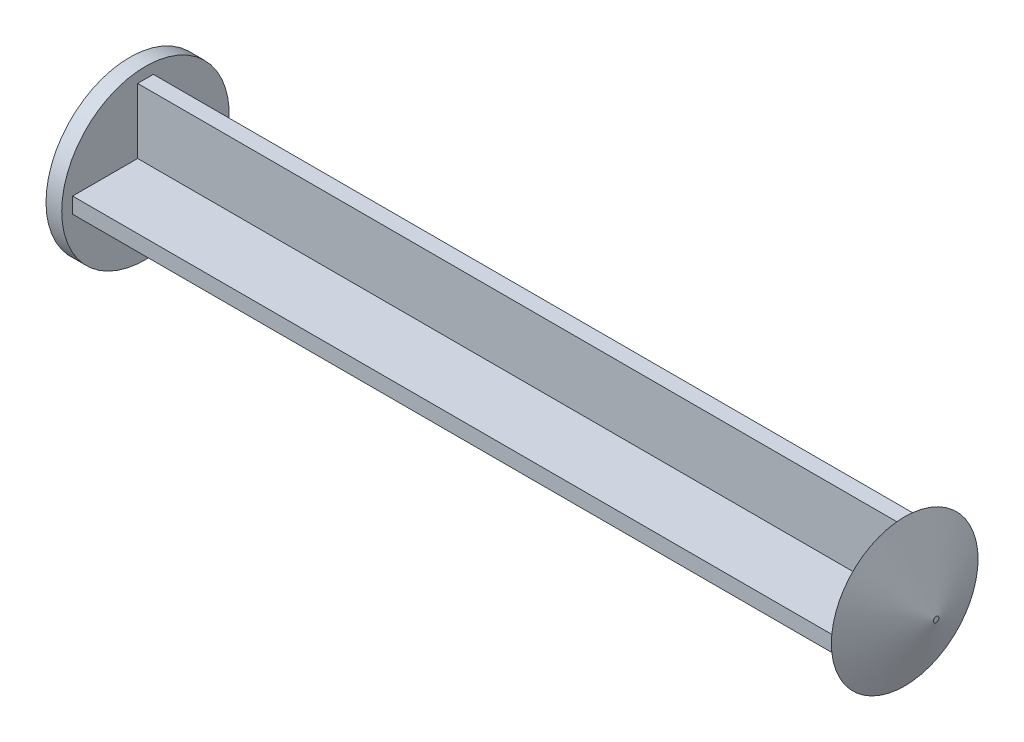
ISO-10303-21;
HEADER;
FILE_DESCRIPTION(('STEP AP214'),'2;1');
FILE_NAME('part.step','',(''),(''),'','','');
FILE_SCHEMA(('AUTOMOTIVE_DESIGN { 1 0 10303 214 1 1 1 1 }'));
ENDSEC;
DATA;
#1=APPLICATION_CONTEXT('core data for automotive mechanical design processes');
#2=APPLICATION_PROTOCOL_DEFINITION('international standard','automotive_design',2000,#1);
#3=PRODUCT_CONTEXT('',#1,'mechanical');
#4=PRODUCT('Part','Part','',(#3));
#5=PRODUCT_RELATED_PRODUCT_CATEGORY('part','',(#4));
#6=PRODUCT_DEFINITION_FORMATION('','',#4);
#7=PRODUCT_DEFINITION_CONTEXT('part definition',#1,'design');
#8=PRODUCT_DEFINITION('design','',#6,#7);
#9=PRODUCT_DEFINITION_SHAPE('','',#8);
#10=(LENGTH_UNIT() NAMED_UNIT(*) SI_UNIT(.MILLI.,.METRE.));
#11=(NAMED_UNIT(*) PLANE_ANGLE_UNIT() SI_UNIT($,.RADIAN.));
#12=(NAMED_UNIT(*) SI_UNIT($,.STERADIAN.) SOLID_ANGLE_UNIT());
#13=UNCERTAINTY_MEASURE_WITH_UNIT(LENGTH_MEASURE(1.E-05),#10,'distance_accuracy_value','');
#14=(GEOMETRIC_REPRESENTATION_CONTEXT(3) GLOBAL_UNCERTAINTY_ASSIGNED_CONTEXT((#13)) GLOBAL_UNIT_ASSIGNED_CONTEXT((#10,
#11,#12)) REPRESENTATION_CONTEXT('',''));
#15=CARTESIAN_POINT('',(0.,0.,0.));
#16=DIRECTION('',(0.,0.,1.));
#17=DIRECTION('',(1.,0.,0.));
#18=AXIS2_PLACEMENT_3D('',#15,#16,#17);
#19=CARTESIAN_POINT('',(0.,0.,0.));
#20=DIRECTION('',(1.,0.,0.));
#21=DIRECTION('',(0.,0.,-1.));
#22=AXIS2_PLACEMENT_3D('',#19,#20,#21);
#23=PLANE('',#22);
#24=DIRECTION('',(0.,0.,-1.));
#25=VECTOR('',#24,1.);
#26=CARTESIAN_POINT('',(0.,1.5,1.5));
#27=LINE('',#26,#25);
#28=CARTESIAN_POINT('',(0.,1.50000000000002,13.9194109070751));
#29=VERTEX_POINT('',#28);
#30=CARTESIAN_POINT('',(0.,1.5,1.5));
#31=VERTEX_POINT('',#30);
#32=EDGE_CURVE('E169',#29,#31,#27,.T.);
#33=ORIENTED_EDGE('',*,*,#32,.F.);
#34=CARTESIAN_POINT('',(0.,0.,0.));
#35=DIRECTION('',(1.,0.,0.));
#36=DIRECTION('',(0.,0.,-1.));
#37=AXIS2_PLACEMENT_3D('',#34,#35,#36);
#38=CIRCLE('',#37,14.);
#39=CARTESIAN_POINT('',(0.,13.9194109070751,1.5));
#40=VERTEX_POINT('',#39);
#41=EDGE_CURVE('E256',#40,#29,#38,.T.);
#42=ORIENTED_EDGE('',*,*,#41,.F.);
#43=DIRECTION('',(0.,1.,0.));
#44=VECTOR('',#43,1.);
#45=CARTESIAN_POINT('',(0.,13.9194109070751,1.5));
#46=LINE('',#45,#44);
#47=EDGE_CURVE('E172',#31,#40,#46,.T.);
#48=ORIENTED_EDGE('',*,*,#47,.F.);
#49=EDGE_LOOP('',(#33,#42,#48));
#50=FACE_BOUND('',#49,.T.);
#51=ADVANCED_FACE('F41',(#50),#23,.F.);
#52=DIRECTION('',(0.,1.,0.));
#53=VECTOR('',#52,1.);
#54=CARTESIAN_POINT('',(0.,-1.5,13.9194109070751));
#55=LINE('',#54,#53);
#56=CARTESIAN_POINT('',(0.,-1.5,13.9194109070751));
#57=VERTEX_POINT('',#56);
#58=EDGE_CURVE('E146',#57,#29,#55,.T.);
#59=ORIENTED_EDGE('',*,*,#58,.F.);
#60=EDGE_CURVE('E269',#29,#57,#38,.T.);
#61=ORIENTED_EDGE('',*,*,#60,.F.);
#62=EDGE_LOOP('',(#59,#61));
#63=FACE_BOUND('',#62,.T.);
#64=ADVANCED_FACE('F335',(#63),#23,.F.);
#65=DIRECTION('',(0.,0.,1.));
#66=VECTOR('',#65,1.);
#67=CARTESIAN_POINT('',(0.,-1.5,1.5));
#68=LINE('',#67,#66);
#69=CARTESIAN_POINT('',(0.,-1.5,1.5));
#70=VERTEX_POINT('',#69);
#71=EDGE_CURVE('E57',#70,#57,#68,.T.);
#72=ORIENTED_EDGE('',*,*,#71,.F.);
#73=DIRECTION('',(0.,1.,0.));
#74=VECTOR('',#73,1.);
#75=CARTESIAN_POINT('',(0.,-1.5,1.5));
#76=LINE('',#75,#74);
#77=CARTESIAN_POINT('',(0.,-13.9194109070751,1.5));
#78=VERTEX_POINT('',#77);
#79=EDGE_CURVE('E202',#78,#70,#76,.T.);
#80=ORIENTED_EDGE('',*,*,#79,.F.);
#81=EDGE_CURVE('E265',#57,#78,#38,.T.);
#82=ORIENTED_EDGE('',*,*,#81,.F.);
#83=EDGE_LOOP('',(#72,#80,#82));
#84=FACE_BOUND('',#83,.T.);
#85=ADVANCED_FACE('F339',(#84),#23,.F.);
#86=DIRECTION('',(0.,0.,1.));
#87=VECTOR('',#86,1.);
#88=CARTESIAN_POINT('',(0.,-13.9194109070751,1.5));
#89=LINE('',#88,#87);
#90=CARTESIAN_POINT('',(0.,-13.9194109070751,-1.5));
#91=VERTEX_POINT('',#90);
#92=EDGE_CURVE('E198',#91,#78,#89,.T.);
#93=ORIENTED_EDGE('',*,*,#92,.F.);
#94=EDGE_CURVE('E262',#78,#91,#38,.T.);
#95=ORIENTED_EDGE('',*,*,#94,.F.);
#96=EDGE_LOOP('',(#93,#95));
#97=FACE_BOUND('',#96,.T.);
#98=ADVANCED_FACE('F373',(#97),#23,.F.);
#99=DIRECTION('',(0.,-1.,0.));
#100=VECTOR('',#99,1.);
#101=CARTESIAN_POINT('',(0.,-1.5,-1.5));
#102=LINE('',#101,#100);
#103=CARTESIAN_POINT('',(0.,-1.5,-1.5));
#104=VERTEX_POINT('',#103);
#105=EDGE_CURVE('E65',#104,#91,#102,.T.);
#106=ORIENTED_EDGE('',*,*,#105,.F.);
#107=DIRECTION('',(0.,0.,1.));
#108=VECTOR('',#107,1.);
#109=CARTESIAN_POINT('',(0.,-1.5,-13.9194109070751));
#110=LINE('',#109,#108);
#111=CARTESIAN_POINT('',(0.,-1.50000000000003,-13.9194109070751));
#112=VERTEX_POINT('',#111);
#113=EDGE_CURVE('E193',#112,#104,#110,.T.);
#114=ORIENTED_EDGE('',*,*,#113,.F.);
#115=EDGE_CURVE('E258',#91,#112,#38,.T.);
#116=ORIENTED_EDGE('',*,*,#115,.F.);
#117=EDGE_LOOP('',(#106,#114,#116));
#118=FACE_BOUND('',#117,.T.);
#119=ADVANCED_FACE('F355',(#118),#23,.F.);
#120=DIRECTION('',(0.,-1.,0.));
#121=VECTOR('',#120,1.);
#122=CARTESIAN_POINT('',(0.,-1.5,-13.9194109070751));
#123=LINE('',#122,#121);
#124=CARTESIAN_POINT('',(0.,1.5,-13.9194109070751));
#125=VERTEX_POINT('',#124);
#126=EDGE_CURVE('E189',#125,#112,#123,.T.);
#127=ORIENTED_EDGE('',*,*,#126,.F.);
#128=EDGE_CURVE('E248',#112,#125,#38,.T.);
#129=ORIENTED_EDGE('',*,*,#128,.F.);
#130=EDGE_LOOP('',(#127,#129));
#131=FACE_BOUND('',#130,.T.);
#132=ADVANCED_FACE('F350',(#131),#23,.F.);
#133=DIRECTION('',(0.,0.,-1.));
#134=VECTOR('',#133,1.);
#135=CARTESIAN_POINT('',(0.,1.5,-13.9194109070751));
#136=LINE('',#135,#134);
#137=CARTESIAN_POINT('',(0.,1.5,-1.5));
#138=VERTEX_POINT('',#137);
#139=EDGE_CURVE('E185',#138,#125,#136,.T.);
#140=ORIENTED_EDGE('',*,*,#139,.F.);
#141=DIRECTION('',(0.,-1.,0.));
#142=VECTOR('',#141,1.);
#143=CARTESIAN_POINT('',(0.,13.9194109070751,-1.5));
#144=LINE('',#143,#142);
#145=CARTESIAN_POINT('',(0.,13.9194109070751,-1.50000000000002));
#146=VERTEX_POINT('',#145);
#147=EDGE_CURVE('E181',#146,#138,#144,.T.);
#148=ORIENTED_EDGE('',*,*,#147,.F.);
#149=EDGE_CURVE('E50',#125,#146,#38,.T.);
#150=ORIENTED_EDGE('',*,*,#149,.F.);
#151=EDGE_LOOP('',(#140,#148,#150));
#152=FACE_BOUND('',#151,.T.);
#153=ADVANCED_FACE('F343',(#152),#23,.F.);
#154=DIRECTION('',(0.,0.,-1.));
#155=VECTOR('',#154,1.);
#156=CARTESIAN_POINT('',(0.,13.9194109070751,1.5));
#157=LINE('',#156,#155);
#158=EDGE_CURVE('E177',#40,#146,#157,.T.);
#159=ORIENTED_EDGE('',*,*,#158,.F.);
#160=EDGE_CURVE('E251',#146,#40,#38,.T.);
#161=ORIENTED_EDGE('',*,*,#160,.F.);
#162=EDGE_LOOP('',(#159,#161));
#163=FACE_BOUND('',#162,.T.);
#164=ADVANCED_FACE('F280',(#163),#23,.F.);
#165=CARTESIAN_POINT('',(0.,0.,0.));
#166=DIRECTION('',(-1.,0.,0.));
#167=DIRECTION('',(0.,0.,-1.));
#168=AXIS2_PLACEMENT_3D('',#165,#166,#167);
#169=CONICAL_SURFACE('',#168,14.,1.15191730631626);
#170=CARTESIAN_POINT('',(6.,0.,0.));
#171=DIRECTION('',(1.,0.,0.));
#172=DIRECTION('',(0.,0.,-1.));
#173=AXIS2_PLACEMENT_3D('',#170,#171,#172);
#174=CIRCLE('',#173,0.523779356574639);
#175=CARTESIAN_POINT('',(6.,0.,-0.523779356574639));
#176=VERTEX_POINT('',#175);
#177=EDGE_CURVE('E11',#176,#176,#174,.T.);
#178=ORIENTED_EDGE('',*,*,#177,.F.);
#179=EDGE_LOOP('',(#178));
#180=FACE_BOUND('',#179,.T.);
#181=ORIENTED_EDGE('',*,*,#149,.T.);
#182=ORIENTED_EDGE('',*,*,#160,.T.);
#183=ORIENTED_EDGE('',*,*,#41,.T.);
#184=ORIENTED_EDGE('',*,*,#60,.T.);
#185=ORIENTED_EDGE('',*,*,#81,.T.);
#186=ORIENTED_EDGE('',*,*,#94,.T.);
#187=ORIENTED_EDGE('',*,*,#115,.T.);
#188=ORIENTED_EDGE('',*,*,#128,.T.);
#189=EDGE_LOOP('',(#181,#182,#183,#184,#185,#186,#187,#188));
#190=FACE_BOUND('',#189,.T.);
#191=ADVANCED_FACE('F43',(#180,#190),#169,.T.);
#192=CARTESIAN_POINT('',(6.,0.,0.));
#193=DIRECTION('',(1.,0.,0.));
#194=DIRECTION('',(0.,0.,-1.));
#195=AXIS2_PLACEMENT_3D('',#192,#193,#194);
#196=PLANE('',#195);
#197=ORIENTED_EDGE('',*,*,#177,.T.);
#198=EDGE_LOOP('',(#197));
#199=FACE_BOUND('',#198,.T.);
#200=ADVANCED_FACE('F348',(#199),#196,.T.);
#201=CARTESIAN_POINT('',(-145.,1.5,1.5));
#202=DIRECTION('',(0.,-1.,0.));
#203=DIRECTION('',(0.,0.,-1.));
#204=AXIS2_PLACEMENT_3D('',#201,#202,#203);
#205=PLANE('',#204);
#206=ORIENTED_EDGE('',*,*,#32,.T.);
#207=DIRECTION('',(1.,0.,0.));
#208=VECTOR('',#207,1.);
#209=CARTESIAN_POINT('',(-145.,1.5,1.5));
#210=LINE('',#209,#208);
#211=CARTESIAN_POINT('',(-145.,1.5,1.5));
#212=VERTEX_POINT('',#211);
#213=EDGE_CURVE('E140',#212,#31,#210,.T.);
#214=ORIENTED_EDGE('',*,*,#213,.F.);
#215=DIRECTION('',(0.,0.,-1.));
#216=VECTOR('',#215,1.);
#217=CARTESIAN_POINT('',(-145.,1.5,1.5));
#218=LINE('',#217,#216);
#219=CARTESIAN_POINT('',(-145.,1.5,13.9194109070751));
#220=VERTEX_POINT('',#219);
#221=EDGE_CURVE('E134',#220,#212,#218,.T.);
#222=ORIENTED_EDGE('',*,*,#221,.F.);
#223=DIRECTION('',(1.,0.,0.));
#224=VECTOR('',#223,1.);
#225=CARTESIAN_POINT('',(-145.,1.5,13.9194109070751));
#226=LINE('',#225,#224);
#227=EDGE_CURVE('E138',#220,#29,#226,.T.);
#228=ORIENTED_EDGE('',*,*,#227,.T.);
#229=EDGE_LOOP('',(#206,#214,#222,#228));
#230=FACE_BOUND('',#229,.T.);
#231=ADVANCED_FACE('F137',(#230),#205,.F.);
#232=CARTESIAN_POINT('',(-145.,13.9194109070751,1.5));
#233=DIRECTION('',(0.,0.,-1.));
#234=DIRECTION('',(0.,1.,0.));
#235=AXIS2_PLACEMENT_3D('',#232,#233,#234);
#236=PLANE('',#235);
#237=ORIENTED_EDGE('',*,*,#47,.T.);
#238=DIRECTION('',(1.,0.,0.));
#239=VECTOR('',#238,1.);
#240=CARTESIAN_POINT('',(-145.,13.9194109070751,1.5));
#241=LINE('',#240,#239);
#242=CARTESIAN_POINT('',(-145.,13.9194109070751,1.5));
#243=VERTEX_POINT('',#242);
#244=EDGE_CURVE('E243',#243,#40,#241,.T.);
#245=ORIENTED_EDGE('',*,*,#244,.F.);
#246=DIRECTION('',(0.,1.,0.));
#247=VECTOR('',#246,1.);
#248=CARTESIAN_POINT('',(-145.,13.9194109070751,1.5));
#249=LINE('',#248,#247);
#250=EDGE_CURVE('E145',#212,#243,#249,.T.);
#251=ORIENTED_EDGE('',*,*,#250,.F.);
#252=ORIENTED_EDGE('',*,*,#213,.T.);
#253=EDGE_LOOP('',(#237,#245,#251,#252));
#254=FACE_BOUND('',#253,.T.);
#255=ADVANCED_FACE('F283',(#254),#236,.F.);
#256=CARTESIAN_POINT('',(-145.,13.9194109070751,1.5));
#257=DIRECTION('',(0.,-1.,0.));
#258=DIRECTION('',(0.,0.,-1.));
#259=AXIS2_PLACEMENT_3D('',#256,#257,#258);
#260=PLANE('',#259);
#261=ORIENTED_EDGE('',*,*,#158,.T.);
#262=DIRECTION('',(1.,0.,0.));
#263=VECTOR('',#262,1.);
#264=CARTESIAN_POINT('',(-145.,13.9194109070751,-1.5));
#265=LINE('',#264,#263);
#266=CARTESIAN_POINT('',(-145.,13.9194109070751,-1.5));
#267=VERTEX_POINT('',#266);
#268=EDGE_CURVE('E239',#267,#146,#265,.T.);
#269=ORIENTED_EDGE('',*,*,#268,.F.);
#270=DIRECTION('',(0.,0.,-1.));
#271=VECTOR('',#270,1.);
#272=CARTESIAN_POINT('',(-145.,13.9194109070751,1.5));
#273=LINE('',#272,#271);
#274=EDGE_CURVE('E287',#243,#267,#273,.T.);
#275=ORIENTED_EDGE('',*,*,#274,.F.);
#276=ORIENTED_EDGE('',*,*,#244,.T.);
#277=EDGE_LOOP('',(#261,#269,#275,#276));
#278=FACE_BOUND('',#277,.T.);
#279=ADVANCED_FACE('F285',(#278),#260,.F.);
#280=CARTESIAN_POINT('',(-145.,13.9194109070751,-1.5));
#281=DIRECTION('',(0.,0.,1.));
#282=DIRECTION('',(0.,-1.,0.));
#283=AXIS2_PLACEMENT_3D('',#280,#281,#282);
#284=PLANE('',#283);
#285=ORIENTED_EDGE('',*,*,#147,.T.);
#286=DIRECTION('',(1.,0.,0.));
#287=VECTOR('',#286,1.);
#288=CARTESIAN_POINT('',(-145.,1.5,-1.5));
#289=LINE('',#288,#287);
#290=CARTESIAN_POINT('',(-145.,1.5,-1.5));
#291=VERTEX_POINT('',#290);
#292=EDGE_CURVE('E235',#291,#138,#289,.T.);
#293=ORIENTED_EDGE('',*,*,#292,.F.);
#294=DIRECTION('',(0.,-1.,0.));
#295=VECTOR('',#294,1.);
#296=CARTESIAN_POINT('',(-145.,13.9194109070751,-1.5));
#297=LINE('',#296,#295);
#298=EDGE_CURVE('E291',#267,#291,#297,.T.);
#299=ORIENTED_EDGE('',*,*,#298,.F.);
#300=ORIENTED_EDGE('',*,*,#268,.T.);
#301=EDGE_LOOP('',(#285,#293,#299,#300));
#302=FACE_BOUND('',#301,.T.);
#303=ADVANCED_FACE('F359',(#302),#284,.F.);
#304=CARTESIAN_POINT('',(-145.,1.5,-13.9194109070751));
#305=DIRECTION('',(0.,-1.,0.));
#306=DIRECTION('',(0.,0.,-1.));
#307=AXIS2_PLACEMENT_3D('',#304,#305,#306);
#308=PLANE('',#307);
#309=ORIENTED_EDGE('',*,*,#139,.T.);
#310=DIRECTION('',(1.,0.,0.));
#311=VECTOR('',#310,1.);
#312=CARTESIAN_POINT('',(-145.,1.5,-13.9194109070751));
#313=LINE('',#312,#311);
#314=CARTESIAN_POINT('',(-145.,1.5,-13.9194109070751));
#315=VERTEX_POINT('',#314);
#316=EDGE_CURVE('E231',#315,#125,#313,.T.);
#317=ORIENTED_EDGE('',*,*,#316,.F.);
#318=DIRECTION('',(0.,0.,-1.));
#319=VECTOR('',#318,1.);
#320=CARTESIAN_POINT('',(-145.,1.5,-13.9194109070751));
#321=LINE('',#320,#319);
#322=EDGE_CURVE('E299',#291,#315,#321,.T.);
#323=ORIENTED_EDGE('',*,*,#322,.F.);
#324=ORIENTED_EDGE('',*,*,#292,.T.);
#325=EDGE_LOOP('',(#309,#317,#323,#324));
#326=FACE_BOUND('',#325,.T.);
#327=ADVANCED_FACE('F361',(#326),#308,.F.);
#328=CARTESIAN_POINT('',(-145.,-1.5,-13.9194109070751));
#329=DIRECTION('',(0.,0.,1.));
#330=DIRECTION('',(1.,0.,0.));
#331=AXIS2_PLACEMENT_3D('',#328,#329,#330);
#332=PLANE('',#331);
#333=ORIENTED_EDGE('',*,*,#126,.T.);
#334=DIRECTION('',(1.,0.,0.));
#335=VECTOR('',#334,1.);
#336=CARTESIAN_POINT('',(-145.,-1.5,-13.9194109070751));
#337=LINE('',#336,#335);
#338=CARTESIAN_POINT('',(-145.,-1.5,-13.9194109070751));
#339=VERTEX_POINT('',#338);
#340=EDGE_CURVE('E227',#339,#112,#337,.T.);
#341=ORIENTED_EDGE('',*,*,#340,.F.);
#342=DIRECTION('',(0.,-1.,0.));
#343=VECTOR('',#342,1.);
#344=CARTESIAN_POINT('',(-145.,-1.5,-13.9194109070751));
#345=LINE('',#344,#343);
#346=EDGE_CURVE('E303',#315,#339,#345,.T.);
#347=ORIENTED_EDGE('',*,*,#346,.F.);
#348=ORIENTED_EDGE('',*,*,#316,.T.);
#349=EDGE_LOOP('',(#333,#341,#347,#348));
#350=FACE_BOUND('',#349,.T.);
#351=ADVANCED_FACE('F365',(#350),#332,.F.);
#352=CARTESIAN_POINT('',(-145.,-1.5,-13.9194109070751));
#353=DIRECTION('',(0.,1.,0.));
#354=DIRECTION('',(0.,0.,1.));
#355=AXIS2_PLACEMENT_3D('',#352,#353,#354);
#356=PLANE('',#355);
#357=ORIENTED_EDGE('',*,*,#113,.T.);
#358=DIRECTION('',(1.,0.,0.));
#359=VECTOR('',#358,1.);
#360=CARTESIAN_POINT('',(-145.,-1.5,-1.5));
#361=LINE('',#360,#359);
#362=CARTESIAN_POINT('',(-145.,-1.5,-1.5));
#363=VERTEX_POINT('',#362);
#364=EDGE_CURVE('E223',#363,#104,#361,.T.);
#365=ORIENTED_EDGE('',*,*,#364,.F.);
#366=DIRECTION('',(0.,0.,1.));
#367=VECTOR('',#366,1.);
#368=CARTESIAN_POINT('',(-145.,-1.5,-13.9194109070751));
#369=LINE('',#368,#367);
#370=EDGE_CURVE('E307',#339,#363,#369,.T.);
#371=ORIENTED_EDGE('',*,*,#370,.F.);
#372=ORIENTED_EDGE('',*,*,#340,.T.);
#373=EDGE_LOOP('',(#357,#365,#371,#372));
#374=FACE_BOUND('',#373,.T.);
#375=ADVANCED_FACE('F367',(#374),#356,.F.);
#376=CARTESIAN_POINT('',(-145.,-1.5,-1.5));
#377=DIRECTION('',(0.,0.,1.));
#378=DIRECTION('',(0.,-1.,0.));
#379=AXIS2_PLACEMENT_3D('',#376,#377,#378);
#380=PLANE('',#379);
#381=ORIENTED_EDGE('',*,*,#105,.T.);
#382=DIRECTION('',(1.,0.,0.));
#383=VECTOR('',#382,1.);
#384=CARTESIAN_POINT('',(-145.,-13.9194109070751,-1.5));
#385=LINE('',#384,#383);
#386=CARTESIAN_POINT('',(-145.,-13.9194109070751,-1.5));
#387=VERTEX_POINT('',#386);
#388=EDGE_CURVE('E219',#387,#91,#385,.T.);
#389=ORIENTED_EDGE('',*,*,#388,.F.);
#390=DIRECTION('',(0.,-1.,0.));
#391=VECTOR('',#390,1.);
#392=CARTESIAN_POINT('',(-145.,-1.5,-1.5));
#393=LINE('',#392,#391);
#394=EDGE_CURVE('E311',#363,#387,#393,.T.);
#395=ORIENTED_EDGE('',*,*,#394,.F.);
#396=ORIENTED_EDGE('',*,*,#364,.T.);
#397=EDGE_LOOP('',(#381,#389,#395,#396));
#398=FACE_BOUND('',#397,.T.);
#399=ADVANCED_FACE('F370',(#398),#380,.F.);
#400=CARTESIAN_POINT('',(-145.,-13.9194109070751,1.5));
#401=DIRECTION('',(0.,1.,0.));
#402=DIRECTION('',(0.,0.,1.));
#403=AXIS2_PLACEMENT_3D('',#400,#401,#402);
#404=PLANE('',#403);
#405=ORIENTED_EDGE('',*,*,#92,.T.);
#406=DIRECTION('',(1.,0.,0.));
#407=VECTOR('',#406,1.);
#408=CARTESIAN_POINT('',(-145.,-13.9194109070751,1.5));
#409=LINE('',#408,#407);
#410=CARTESIAN_POINT('',(-145.,-13.9194109070751,1.5));
#411=VERTEX_POINT('',#410);
#412=EDGE_CURVE('E215',#411,#78,#409,.T.);
#413=ORIENTED_EDGE('',*,*,#412,.F.);
#414=DIRECTION('',(0.,0.,1.));
#415=VECTOR('',#414,1.);
#416=CARTESIAN_POINT('',(-145.,-13.9194109070751,1.5));
#417=LINE('',#416,#415);
#418=EDGE_CURVE('E315',#387,#411,#417,.T.);
#419=ORIENTED_EDGE('',*,*,#418,.F.);
#420=ORIENTED_EDGE('',*,*,#388,.T.);
#421=EDGE_LOOP('',(#405,#413,#419,#420));
#422=FACE_BOUND('',#421,.T.);
#423=ADVANCED_FACE('F332',(#422),#404,.F.);
#424=CARTESIAN_POINT('',(-145.,-1.5,1.5));
#425=DIRECTION('',(0.,0.,-1.));
#426=DIRECTION('',(0.,1.,0.));
#427=AXIS2_PLACEMENT_3D('',#424,#425,#426);
#428=PLANE('',#427);
#429=ORIENTED_EDGE('',*,*,#79,.T.);
#430=DIRECTION('',(1.,0.,0.));
#431=VECTOR('',#430,1.);
#432=CARTESIAN_POINT('',(-145.,-1.5,1.5));
#433=LINE('',#432,#431);
#434=CARTESIAN_POINT('',(-145.,-1.5,1.5));
#435=VERTEX_POINT('',#434);
#436=EDGE_CURVE('E211',#435,#70,#433,.T.);
#437=ORIENTED_EDGE('',*,*,#436,.F.);
#438=DIRECTION('',(0.,1.,0.));
#439=VECTOR('',#438,1.);
#440=CARTESIAN_POINT('',(-145.,-1.5,1.5));
#441=LINE('',#440,#439);
#442=EDGE_CURVE('E165',#411,#435,#441,.T.);
#443=ORIENTED_EDGE('',*,*,#442,.F.);
#444=ORIENTED_EDGE('',*,*,#412,.T.);
#445=EDGE_LOOP('',(#429,#437,#443,#444));
#446=FACE_BOUND('',#445,.T.);
#447=ADVANCED_FACE('F322',(#446),#428,.F.);
#448=CARTESIAN_POINT('',(-145.,-1.5,1.5));
#449=DIRECTION('',(0.,1.,0.));
#450=DIRECTION('',(0.,0.,1.));
#451=AXIS2_PLACEMENT_3D('',#448,#449,#450);
#452=PLANE('',#451);
#453=ORIENTED_EDGE('',*,*,#71,.T.);
#454=DIRECTION('',(1.,0.,0.));
#455=VECTOR('',#454,1.);
#456=CARTESIAN_POINT('',(-145.,-1.5,13.9194109070751));
#457=LINE('',#456,#455);
#458=CARTESIAN_POINT('',(-145.,-1.5,13.9194109070751));
#459=VERTEX_POINT('',#458);
#460=EDGE_CURVE('E156',#459,#57,#457,.T.);
#461=ORIENTED_EDGE('',*,*,#460,.F.);
#462=DIRECTION('',(0.,0.,1.));
#463=VECTOR('',#462,1.);
#464=CARTESIAN_POINT('',(-145.,-1.5,1.5));
#465=LINE('',#464,#463);
#466=EDGE_CURVE('E161',#435,#459,#465,.T.);
#467=ORIENTED_EDGE('',*,*,#466,.F.);
#468=ORIENTED_EDGE('',*,*,#436,.T.);
#469=EDGE_LOOP('',(#453,#461,#467,#468));
#470=FACE_BOUND('',#469,.T.);
#471=ADVANCED_FACE('F324',(#470),#452,.F.);
#472=CARTESIAN_POINT('',(-145.,-1.5,13.9194109070751));
#473=DIRECTION('',(0.,0.,-1.));
#474=DIRECTION('',(-1.,0.,0.));
#475=AXIS2_PLACEMENT_3D('',#472,#473,#474);
#476=PLANE('',#475);
#477=ORIENTED_EDGE('',*,*,#58,.T.);
#478=ORIENTED_EDGE('',*,*,#227,.F.);
#479=DIRECTION('',(0.,1.,0.));
#480=VECTOR('',#479,1.);
#481=CARTESIAN_POINT('',(-145.,-1.5,13.9194109070751));
#482=LINE('',#481,#480);
#483=EDGE_CURVE('E153',#459,#220,#482,.T.);
#484=ORIENTED_EDGE('',*,*,#483,.F.);
#485=ORIENTED_EDGE('',*,*,#460,.T.);
#486=EDGE_LOOP('',(#477,#478,#484,#485));
#487=FACE_BOUND('',#486,.T.);
#488=ADVANCED_FACE('F151',(#487),#476,.F.);
#489=CARTESIAN_POINT('',(-145.,0.,0.));
#490=DIRECTION('',(-1.,0.,0.));
#491=DIRECTION('',(0.,0.,1.));
#492=AXIS2_PLACEMENT_3D('',#489,#490,#491);
#493=PLANE('',#492);
#494=CARTESIAN_POINT('',(-145.,0.,0.));
#495=DIRECTION('',(-1.,0.,0.));
#496=DIRECTION('',(0.,0.,1.));
#497=AXIS2_PLACEMENT_3D('',#494,#495,#496);
#498=CIRCLE('',#497,16.);
#499=CARTESIAN_POINT('',(-145.,0.,16.));
#500=VERTEX_POINT('',#499);
#501=EDGE_CURVE('E509',#500,#500,#498,.T.);
#502=ORIENTED_EDGE('',*,*,#501,.F.);
#503=EDGE_LOOP('',(#502));
#504=FACE_BOUND('',#503,.T.);
#505=ORIENTED_EDGE('',*,*,#483,.T.);
#506=ORIENTED_EDGE('',*,*,#221,.T.);
#507=ORIENTED_EDGE('',*,*,#250,.T.);
#508=ORIENTED_EDGE('',*,*,#274,.T.);
#509=ORIENTED_EDGE('',*,*,#298,.T.);
#510=ORIENTED_EDGE('',*,*,#322,.T.);
#511=ORIENTED_EDGE('',*,*,#346,.T.);
#512=ORIENTED_EDGE('',*,*,#370,.T.);
#513=ORIENTED_EDGE('',*,*,#394,.T.);
#514=ORIENTED_EDGE('',*,*,#418,.T.);
#515=ORIENTED_EDGE('',*,*,#442,.T.);
#516=ORIENTED_EDGE('',*,*,#466,.T.);
#517=EDGE_LOOP('',(#505,#506,#507,#508,#509,#510,#511,#512,#513,#514,#515,#516));
#518=FACE_BOUND('',#517,.T.);
#519=ADVANCED_FACE('F158',(#504,#518),#493,.F.);
#520=CARTESIAN_POINT('',(-148.,0.,0.));
#521=DIRECTION('',(1.,0.,0.));
#522=DIRECTION('',(0.,0.,-1.));
#523=AXIS2_PLACEMENT_3D('',#520,#521,#522);
#524=CYLINDRICAL_SURFACE('',#523,16.);
#525=CARTESIAN_POINT('',(-148.,0.,0.));
#526=DIRECTION('',(-1.,0.,0.));
#527=DIRECTION('',(0.,0.,1.));
#528=AXIS2_PLACEMENT_3D('',#525,#526,#527);
#529=CIRCLE('',#528,16.);
#530=CARTESIAN_POINT('',(-148.,0.,16.));
#531=VERTEX_POINT('',#530);
#532=EDGE_CURVE('E173',#531,#531,#529,.T.);
#533=ORIENTED_EDGE('',*,*,#532,.F.);
#534=EDGE_LOOP('',(#533));
#535=FACE_BOUND('',#534,.T.);
#536=ORIENTED_EDGE('',*,*,#501,.T.);
#537=EDGE_LOOP('',(#536));
#538=FACE_BOUND('',#537,.T.);
#539=ADVANCED_FACE('F482',(#535,#538),#524,.T.);
#540=CARTESIAN_POINT('',(-148.,0.,0.));
#541=DIRECTION('',(-1.,0.,0.));
#542=DIRECTION('',(0.,0.,1.));
#543=AXIS2_PLACEMENT_3D('',#540,#541,#542);
#544=PLANE('',#543);
#545=ORIENTED_EDGE('',*,*,#532,.T.);
#546=EDGE_LOOP('',(#545));
#547=FACE_BOUND('',#546,.T.);
#548=ADVANCED_FACE('F492',(#547),#544,.T.);
#549=CLOSED_SHELL('',(#51,#64,#85,#98,#119,#132,#153,#164,#191,#200,#231,#255,#279,#303,#327,
#351,#375,#399,#423,#447,#471,#488,#519,#539,#548));
#550=MANIFOLD_SOLID_BREP('B2',#549);
#551=ADVANCED_BREP_SHAPE_REPRESENTATION('',(#18,#550),#14);
#552=SHAPE_DEFINITION_REPRESENTATION(#9,#551);
ENDSEC;
END-ISO-10303-21;
